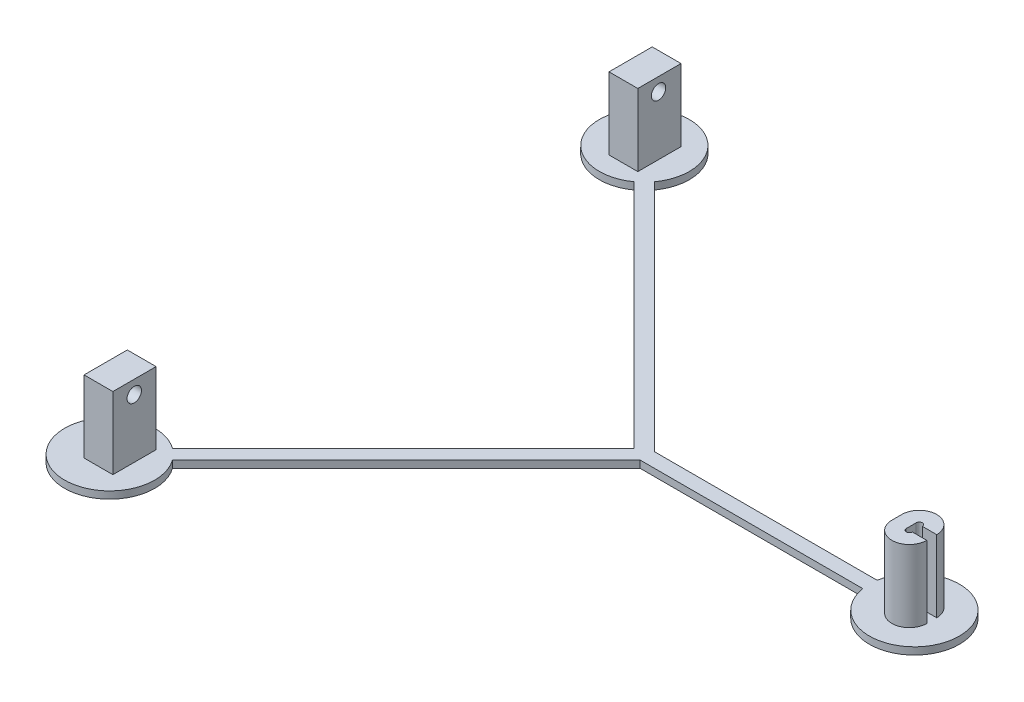
ISO-10303-21;
HEADER;
FILE_DESCRIPTION(('STEP AP214'),'2;1');
FILE_NAME('part.step','',(''),(''),'','','');
FILE_SCHEMA(('AUTOMOTIVE_DESIGN { 1 0 10303 214 1 1 1 1 }'));
ENDSEC;
DATA;
#1=APPLICATION_CONTEXT('core data for automotive mechanical design processes');
#2=APPLICATION_PROTOCOL_DEFINITION('international standard','automotive_design',2000,#1);
#3=PRODUCT_CONTEXT('',#1,'mechanical');
#4=PRODUCT('Part','Part','',(#3));
#5=PRODUCT_RELATED_PRODUCT_CATEGORY('part','',(#4));
#6=PRODUCT_DEFINITION_FORMATION('','',#4);
#7=PRODUCT_DEFINITION_CONTEXT('part definition',#1,'design');
#8=PRODUCT_DEFINITION('design','',#6,#7);
#9=PRODUCT_DEFINITION_SHAPE('','',#8);
#10=(LENGTH_UNIT() NAMED_UNIT(*) SI_UNIT(.MILLI.,.METRE.));
#11=(NAMED_UNIT(*) PLANE_ANGLE_UNIT() SI_UNIT($,.RADIAN.));
#12=(NAMED_UNIT(*) SI_UNIT($,.STERADIAN.) SOLID_ANGLE_UNIT());
#13=UNCERTAINTY_MEASURE_WITH_UNIT(LENGTH_MEASURE(1.E-05),#10,'distance_accuracy_value','');
#14=(GEOMETRIC_REPRESENTATION_CONTEXT(3) GLOBAL_UNCERTAINTY_ASSIGNED_CONTEXT((#13)) GLOBAL_UNIT_ASSIGNED_CONTEXT((#10,
#11,#12)) REPRESENTATION_CONTEXT('',''));
#15=CARTESIAN_POINT('',(0.,0.,0.));
#16=DIRECTION('',(0.,0.,1.));
#17=DIRECTION('',(1.,0.,0.));
#18=AXIS2_PLACEMENT_3D('',#15,#16,#17);
#19=CARTESIAN_POINT('',(0.,2.,-152.499999999999));
#20=DIRECTION('',(0.,-1.,0.));
#21=DIRECTION('',(0.,0.,-1.));
#22=AXIS2_PLACEMENT_3D('',#19,#20,#21);
#23=CYLINDRICAL_SURFACE('',#22,12.5);
#24=CARTESIAN_POINT('',(0.,0.,-152.499999999999));
#25=DIRECTION('',(0.,1.,0.));
#26=DIRECTION('',(0.,0.,1.));
#27=AXIS2_PLACEMENT_3D('',#24,#25,#26);
#28=CIRCLE('',#27,12.5);
#29=CARTESIAN_POINT('',(10.1391777456807,0.,-145.189249379065));
#30=VERTEX_POINT('',#29);
#31=CARTESIAN_POINT('',(7.31075062093449,0.,-142.360822254319));
#32=VERTEX_POINT('',#31);
#33=EDGE_CURVE('E260',#30,#32,#28,.T.);
#34=ORIENTED_EDGE('',*,*,#33,.T.);
#35=DIRECTION('',(0.,-1.,0.));
#36=VECTOR('',#35,1.);
#37=CARTESIAN_POINT('',(7.31075062093449,2.,-142.360822254319));
#38=LINE('',#37,#36);
#39=CARTESIAN_POINT('',(7.31075062093449,2.,-142.360822254319));
#40=VERTEX_POINT('',#39);
#41=EDGE_CURVE('E11',#40,#32,#38,.T.);
#42=ORIENTED_EDGE('',*,*,#41,.F.);
#43=CARTESIAN_POINT('',(0.,2.,-152.499999999999));
#44=DIRECTION('',(0.,1.,0.));
#45=DIRECTION('',(0.,0.,1.));
#46=AXIS2_PLACEMENT_3D('',#43,#44,#45);
#47=CIRCLE('',#46,12.5);
#48=CARTESIAN_POINT('',(10.1391777456807,2.,-145.189249379065));
#49=VERTEX_POINT('',#48);
#50=EDGE_CURVE('E261',#49,#40,#47,.T.);
#51=ORIENTED_EDGE('',*,*,#50,.F.);
#52=DIRECTION('',(0.,-1.,0.));
#53=VECTOR('',#52,1.);
#54=CARTESIAN_POINT('',(10.1391777456807,2.,-145.189249379065));
#55=LINE('',#54,#53);
#56=EDGE_CURVE('E281',#49,#30,#55,.T.);
#57=ORIENTED_EDGE('',*,*,#56,.T.);
#58=EDGE_LOOP('',(#34,#42,#51,#57));
#59=FACE_BOUND('',#58,.T.);
#60=ADVANCED_FACE('F33',(#59),#23,.T.);
#61=CARTESIAN_POINT('',(71.4177848998413,2.,-78.2537879754117));
#62=DIRECTION('',(0.707106781186547,0.,-0.707106781186548));
#63=DIRECTION('',(-0.707106781186548,0.,-0.707106781186547));
#64=AXIS2_PLACEMENT_3D('',#61,#62,#63);
#65=PLANE('',#64);
#66=DIRECTION('',(0.707106781186548,0.,0.707106781186547));
#67=VECTOR('',#66,1.);
#68=CARTESIAN_POINT('',(71.4177848998413,0.,-78.2537879754117));
#69=LINE('',#68,#67);
#70=CARTESIAN_POINT('',(71.4177848998413,0.,-78.2537879754117));
#71=VERTEX_POINT('',#70);
#72=EDGE_CURVE('E284',#32,#71,#69,.T.);
#73=ORIENTED_EDGE('',*,*,#72,.T.);
#74=DIRECTION('',(0.,-1.,0.));
#75=VECTOR('',#74,1.);
#76=CARTESIAN_POINT('',(71.4177848998413,2.,-78.2537879754117));
#77=LINE('',#76,#75);
#78=CARTESIAN_POINT('',(71.4177848998413,2.,-78.2537879754117));
#79=VERTEX_POINT('',#78);
#80=EDGE_CURVE('E40',#79,#71,#77,.T.);
#81=ORIENTED_EDGE('',*,*,#80,.F.);
#82=DIRECTION('',(0.707106781186548,0.,0.707106781186547));
#83=VECTOR('',#82,1.);
#84=CARTESIAN_POINT('',(71.4177848998413,2.,-78.2537879754117));
#85=LINE('',#84,#83);
#86=EDGE_CURVE('E264',#40,#79,#85,.T.);
#87=ORIENTED_EDGE('',*,*,#86,.F.);
#88=ORIENTED_EDGE('',*,*,#41,.T.);
#89=EDGE_LOOP('',(#73,#81,#87,#88));
#90=FACE_BOUND('',#89,.T.);
#91=ADVANCED_FACE('F346',(#90),#65,.F.);
#92=CARTESIAN_POINT('',(71.4177848998413,2.,-78.2537879754117));
#93=DIRECTION('',(0.707106781186548,0.,0.707106781186547));
#94=DIRECTION('',(0.707106781186547,0.,-0.707106781186548));
#95=AXIS2_PLACEMENT_3D('',#92,#93,#94);
#96=PLANE('',#95);
#97=DIRECTION('',(-0.707106781186547,0.,0.707106781186548));
#98=VECTOR('',#97,1.);
#99=CARTESIAN_POINT('',(71.4177848998413,0.,-78.2537879754117));
#100=LINE('',#99,#98);
#101=CARTESIAN_POINT('',(7.3107506209346,0.,-14.1467536965049));
#102=VERTEX_POINT('',#101);
#103=EDGE_CURVE('E286',#71,#102,#100,.T.);
#104=ORIENTED_EDGE('',*,*,#103,.T.);
#105=DIRECTION('',(0.,-1.,0.));
#106=VECTOR('',#105,1.);
#107=CARTESIAN_POINT('',(7.3107506209346,2.,-14.1467536965049));
#108=LINE('',#107,#106);
#109=CARTESIAN_POINT('',(7.3107506209346,2.,-14.1467536965049));
#110=VERTEX_POINT('',#109);
#111=EDGE_CURVE('E316',#110,#102,#108,.T.);
#112=ORIENTED_EDGE('',*,*,#111,.F.);
#113=DIRECTION('',(-0.707106781186547,0.,0.707106781186548));
#114=VECTOR('',#113,1.);
#115=CARTESIAN_POINT('',(71.4177848998413,2.,-78.2537879754117));
#116=LINE('',#115,#114);
#117=EDGE_CURVE('E267',#79,#110,#116,.T.);
#118=ORIENTED_EDGE('',*,*,#117,.F.);
#119=ORIENTED_EDGE('',*,*,#80,.T.);
#120=EDGE_LOOP('',(#104,#112,#118,#119));
#121=FACE_BOUND('',#120,.T.);
#122=ADVANCED_FACE('F323',(#121),#96,.F.);
#123=CARTESIAN_POINT('',(1.17961196366422E-13,2.,-4.00757595082419));
#124=DIRECTION('',(0.,-1.,0.));
#125=DIRECTION('',(0.,0.,-1.));
#126=AXIS2_PLACEMENT_3D('',#123,#124,#125);
#127=CYLINDRICAL_SURFACE('',#126,12.5);
#128=CARTESIAN_POINT('',(1.17961196366422E-13,0.,-4.00757595082419));
#129=DIRECTION('',(0.,1.,0.));
#130=DIRECTION('',(0.,0.,1.));
#131=AXIS2_PLACEMENT_3D('',#128,#129,#130);
#132=CIRCLE('',#131,12.5);
#133=CARTESIAN_POINT('',(10.1391777456808,0.,-11.3183265717587));
#134=VERTEX_POINT('',#133);
#135=EDGE_CURVE('E288',#102,#134,#132,.T.);
#136=ORIENTED_EDGE('',*,*,#135,.T.);
#137=DIRECTION('',(0.,-1.,0.));
#138=VECTOR('',#137,1.);
#139=CARTESIAN_POINT('',(10.1391777456808,2.,-11.3183265717587));
#140=LINE('',#139,#138);
#141=CARTESIAN_POINT('',(10.1391777456808,2.,-11.3183265717587));
#142=VERTEX_POINT('',#141);
#143=EDGE_CURVE('E313',#142,#134,#140,.T.);
#144=ORIENTED_EDGE('',*,*,#143,.F.);
#145=CARTESIAN_POINT('',(1.17961196366422E-13,2.,-4.00757595082419));
#146=DIRECTION('',(0.,1.,0.));
#147=DIRECTION('',(0.,0.,1.));
#148=AXIS2_PLACEMENT_3D('',#145,#146,#147);
#149=CIRCLE('',#148,12.5);
#150=EDGE_CURVE('E269',#110,#142,#149,.T.);
#151=ORIENTED_EDGE('',*,*,#150,.F.);
#152=ORIENTED_EDGE('',*,*,#111,.T.);
#153=EDGE_LOOP('',(#136,#144,#151,#152));
#154=FACE_BOUND('',#153,.T.);
#155=ADVANCED_FACE('F334',(#154),#127,.T.);
#156=CARTESIAN_POINT('',(75.0746391493337,2.,-76.2537879754117));
#157=DIRECTION('',(-0.707106781186548,0.,-0.707106781186547));
#158=DIRECTION('',(-0.707106781186547,0.,0.707106781186548));
#159=AXIS2_PLACEMENT_3D('',#156,#157,#158);
#160=PLANE('',#159);
#161=DIRECTION('',(0.707106781186547,0.,-0.707106781186548));
#162=VECTOR('',#161,1.);
#163=CARTESIAN_POINT('',(75.0746391493337,0.,-76.2537879754117));
#164=LINE('',#163,#162);
#165=CARTESIAN_POINT('',(75.0746391493337,0.,-76.2537879754117));
#166=VERTEX_POINT('',#165);
#167=EDGE_CURVE('E290',#134,#166,#164,.T.);
#168=ORIENTED_EDGE('',*,*,#167,.T.);
#169=DIRECTION('',(0.,-1.,0.));
#170=VECTOR('',#169,1.);
#171=CARTESIAN_POINT('',(75.0746391493337,2.,-76.2537879754117));
#172=LINE('',#171,#170);
#173=CARTESIAN_POINT('',(75.0746391493337,2.,-76.2537879754117));
#174=VERTEX_POINT('',#173);
#175=EDGE_CURVE('E310',#174,#166,#172,.T.);
#176=ORIENTED_EDGE('',*,*,#175,.F.);
#177=DIRECTION('',(0.707106781186547,0.,-0.707106781186548));
#178=VECTOR('',#177,1.);
#179=CARTESIAN_POINT('',(75.0746391493337,2.,-76.2537879754117));
#180=LINE('',#179,#178);
#181=EDGE_CURVE('E271',#142,#174,#180,.T.);
#182=ORIENTED_EDGE('',*,*,#181,.F.);
#183=ORIENTED_EDGE('',*,*,#143,.T.);
#184=EDGE_LOOP('',(#168,#176,#182,#183));
#185=FACE_BOUND('',#184,.T.);
#186=ADVANCED_FACE('F338',(#185),#160,.F.);
#187=CARTESIAN_POINT('',(75.0746391493337,2.,-76.2537879754117));
#188=DIRECTION('',(0.,0.,-1.));
#189=DIRECTION('',(-1.,0.,0.));
#190=AXIS2_PLACEMENT_3D('',#187,#188,#189);
#191=PLANE('',#190);
#192=DIRECTION('',(1.,0.,0.));
#193=VECTOR('',#192,1.);
#194=CARTESIAN_POINT('',(75.0746391493337,0.,-76.2537879754117));
#195=LINE('',#194,#193);
#196=CARTESIAN_POINT('',(136.907249345323,0.,-76.2537879754117));
#197=VERTEX_POINT('',#196);
#198=EDGE_CURVE('E292',#166,#197,#195,.T.);
#199=ORIENTED_EDGE('',*,*,#198,.T.);
#200=DIRECTION('',(0.,-1.,0.));
#201=VECTOR('',#200,1.);
#202=CARTESIAN_POINT('',(136.907249345323,2.,-76.2537879754117));
#203=LINE('',#202,#201);
#204=CARTESIAN_POINT('',(136.907249345323,2.,-76.2537879754117));
#205=VERTEX_POINT('',#204);
#206=EDGE_CURVE('E307',#205,#197,#203,.T.);
#207=ORIENTED_EDGE('',*,*,#206,.F.);
#208=DIRECTION('',(1.,0.,0.));
#209=VECTOR('',#208,1.);
#210=CARTESIAN_POINT('',(75.0746391493337,2.,-76.2537879754117));
#211=LINE('',#210,#209);
#212=EDGE_CURVE('E273',#174,#205,#211,.T.);
#213=ORIENTED_EDGE('',*,*,#212,.F.);
#214=ORIENTED_EDGE('',*,*,#175,.T.);
#215=EDGE_LOOP('',(#199,#207,#213,#214));
#216=FACE_BOUND('',#215,.T.);
#217=ADVANCED_FACE('F364',(#216),#191,.F.);
#218=CARTESIAN_POINT('',(149.246212024576,2.,-78.2537879754121));
#219=DIRECTION('',(0.,-1.,0.));
#220=DIRECTION('',(0.,0.,-1.));
#221=AXIS2_PLACEMENT_3D('',#218,#219,#220);
#222=CYLINDRICAL_SURFACE('',#221,12.5);
#223=CARTESIAN_POINT('',(149.246212024576,0.,-78.2537879754121));
#224=DIRECTION('',(0.,1.,0.));
#225=DIRECTION('',(0.,0.,1.));
#226=AXIS2_PLACEMENT_3D('',#223,#224,#225);
#227=CIRCLE('',#226,12.5);
#228=CARTESIAN_POINT('',(136.907249345323,0.,-80.2537879754117));
#229=VERTEX_POINT('',#228);
#230=EDGE_CURVE('E294',#197,#229,#227,.T.);
#231=ORIENTED_EDGE('',*,*,#230,.T.);
#232=DIRECTION('',(0.,-1.,0.));
#233=VECTOR('',#232,1.);
#234=CARTESIAN_POINT('',(136.907249345323,2.,-80.2537879754117));
#235=LINE('',#234,#233);
#236=CARTESIAN_POINT('',(136.907249345323,2.,-80.2537879754117));
#237=VERTEX_POINT('',#236);
#238=EDGE_CURVE('E304',#237,#229,#235,.T.);
#239=ORIENTED_EDGE('',*,*,#238,.F.);
#240=CARTESIAN_POINT('',(149.246212024576,2.,-78.2537879754121));
#241=DIRECTION('',(0.,1.,0.));
#242=DIRECTION('',(0.,0.,1.));
#243=AXIS2_PLACEMENT_3D('',#240,#241,#242);
#244=CIRCLE('',#243,12.5);
#245=EDGE_CURVE('E275',#205,#237,#244,.T.);
#246=ORIENTED_EDGE('',*,*,#245,.F.);
#247=ORIENTED_EDGE('',*,*,#206,.T.);
#248=EDGE_LOOP('',(#231,#239,#246,#247));
#249=FACE_BOUND('',#248,.T.);
#250=ADVANCED_FACE('F362',(#249),#222,.T.);
#251=CARTESIAN_POINT('',(75.0746391493337,2.,-80.2537879754117));
#252=DIRECTION('',(0.,0.,1.));
#253=DIRECTION('',(1.,0.,0.));
#254=AXIS2_PLACEMENT_3D('',#251,#252,#253);
#255=PLANE('',#254);
#256=DIRECTION('',(-1.,0.,0.));
#257=VECTOR('',#256,1.);
#258=CARTESIAN_POINT('',(75.0746391493337,0.,-80.2537879754117));
#259=LINE('',#258,#257);
#260=CARTESIAN_POINT('',(75.0746391493337,0.,-80.2537879754117));
#261=VERTEX_POINT('',#260);
#262=EDGE_CURVE('E296',#229,#261,#259,.T.);
#263=ORIENTED_EDGE('',*,*,#262,.T.);
#264=DIRECTION('',(0.,-1.,0.));
#265=VECTOR('',#264,1.);
#266=CARTESIAN_POINT('',(75.0746391493337,2.,-80.2537879754117));
#267=LINE('',#266,#265);
#268=CARTESIAN_POINT('',(75.0746391493337,2.,-80.2537879754117));
#269=VERTEX_POINT('',#268);
#270=EDGE_CURVE('E301',#269,#261,#267,.T.);
#271=ORIENTED_EDGE('',*,*,#270,.F.);
#272=DIRECTION('',(-1.,0.,0.));
#273=VECTOR('',#272,1.);
#274=CARTESIAN_POINT('',(75.0746391493337,2.,-80.2537879754117));
#275=LINE('',#274,#273);
#276=EDGE_CURVE('E277',#237,#269,#275,.T.);
#277=ORIENTED_EDGE('',*,*,#276,.F.);
#278=ORIENTED_EDGE('',*,*,#238,.T.);
#279=EDGE_LOOP('',(#263,#271,#277,#278));
#280=FACE_BOUND('',#279,.T.);
#281=ADVANCED_FACE('F358',(#280),#255,.F.);
#282=CARTESIAN_POINT('',(75.0746391493337,2.,-80.2537879754117));
#283=DIRECTION('',(-0.707106781186547,0.,0.707106781186548));
#284=DIRECTION('',(0.707106781186548,0.,0.707106781186547));
#285=AXIS2_PLACEMENT_3D('',#282,#283,#284);
#286=PLANE('',#285);
#287=DIRECTION('',(-0.707106781186548,0.,-0.707106781186547));
#288=VECTOR('',#287,1.);
#289=CARTESIAN_POINT('',(75.0746391493337,0.,-80.2537879754117));
#290=LINE('',#289,#288);
#291=EDGE_CURVE('E265',#261,#30,#290,.T.);
#292=ORIENTED_EDGE('',*,*,#291,.T.);
#293=ORIENTED_EDGE('',*,*,#56,.F.);
#294=DIRECTION('',(-0.707106781186548,0.,-0.707106781186547));
#295=VECTOR('',#294,1.);
#296=CARTESIAN_POINT('',(75.0746391493337,2.,-80.2537879754117));
#297=LINE('',#296,#295);
#298=EDGE_CURVE('E279',#269,#49,#297,.T.);
#299=ORIENTED_EDGE('',*,*,#298,.F.);
#300=ORIENTED_EDGE('',*,*,#270,.T.);
#301=EDGE_LOOP('',(#292,#293,#299,#300));
#302=FACE_BOUND('',#301,.T.);
#303=ADVANCED_FACE('F353',(#302),#286,.F.);
#304=CARTESIAN_POINT('',(0.,0.,-152.499999999999));
#305=DIRECTION('',(0.,1.,0.));
#306=DIRECTION('',(0.,0.,1.));
#307=AXIS2_PLACEMENT_3D('',#304,#305,#306);
#308=PLANE('',#307);
#309=ORIENTED_EDGE('',*,*,#33,.F.);
#310=ORIENTED_EDGE('',*,*,#291,.F.);
#311=ORIENTED_EDGE('',*,*,#262,.F.);
#312=ORIENTED_EDGE('',*,*,#230,.F.);
#313=ORIENTED_EDGE('',*,*,#198,.F.);
#314=ORIENTED_EDGE('',*,*,#167,.F.);
#315=ORIENTED_EDGE('',*,*,#135,.F.);
#316=ORIENTED_EDGE('',*,*,#103,.F.);
#317=ORIENTED_EDGE('',*,*,#72,.F.);
#318=EDGE_LOOP('',(#309,#310,#311,#312,#313,#314,#315,#316,#317));
#319=FACE_BOUND('',#318,.T.);
#320=ADVANCED_FACE('F329',(#319),#308,.F.);
#321=CARTESIAN_POINT('',(149.346212024576,22.,-76.7537879754121));
#322=DIRECTION('',(0.,1.,0.));
#323=DIRECTION('',(0.,0.,1.));
#324=AXIS2_PLACEMENT_3D('',#321,#322,#323);
#325=PLANE('',#324);
#326=DIRECTION('',(-1.,0.,0.));
#327=VECTOR('',#326,1.);
#328=CARTESIAN_POINT('',(150.196212024576,22.,-79.5037879754121));
#329=LINE('',#328,#327);
#330=CARTESIAN_POINT('',(154.196212024576,22.,-79.5037879754121));
#331=VERTEX_POINT('',#330);
#332=CARTESIAN_POINT('',(150.196212024576,22.,-79.5037879754121));
#333=VERTEX_POINT('',#332);
#334=EDGE_CURVE('E212',#331,#333,#329,.T.);
#335=ORIENTED_EDGE('',*,*,#334,.F.);
#336=CARTESIAN_POINT('',(149.346212024576,22.,-79.5037879754121));
#337=DIRECTION('',(0.,1.,0.));
#338=DIRECTION('',(0.,0.,1.));
#339=AXIS2_PLACEMENT_3D('',#336,#337,#338);
#340=CIRCLE('',#339,4.84999999999999);
#341=CARTESIAN_POINT('',(144.496212024576,22.,-79.5037879754121));
#342=VERTEX_POINT('',#341);
#343=EDGE_CURVE('E243',#331,#342,#340,.T.);
#344=ORIENTED_EDGE('',*,*,#343,.T.);
#345=DIRECTION('',(0.,0.,1.));
#346=VECTOR('',#345,1.);
#347=CARTESIAN_POINT('',(144.496212024576,22.,-76.7537879754121));
#348=LINE('',#347,#346);
#349=CARTESIAN_POINT('',(144.496212024576,22.,-76.7537879754121));
#350=VERTEX_POINT('',#349);
#351=EDGE_CURVE('E246',#342,#350,#348,.T.);
#352=ORIENTED_EDGE('',*,*,#351,.T.);
#353=CARTESIAN_POINT('',(149.346212024576,22.,-76.7537879754121));
#354=DIRECTION('',(0.,1.,0.));
#355=DIRECTION('',(0.,0.,1.));
#356=AXIS2_PLACEMENT_3D('',#353,#354,#355);
#357=CIRCLE('',#356,4.84999999999999);
#358=CARTESIAN_POINT('',(154.196212024576,22.,-76.7537879754121));
#359=VERTEX_POINT('',#358);
#360=EDGE_CURVE('E240',#350,#359,#357,.T.);
#361=ORIENTED_EDGE('',*,*,#360,.T.);
#362=DIRECTION('',(1.,0.,0.));
#363=VECTOR('',#362,1.);
#364=CARTESIAN_POINT('',(150.196212024576,22.,-76.7537879754121));
#365=LINE('',#364,#363);
#366=CARTESIAN_POINT('',(150.196212024576,22.,-76.7537879754121));
#367=VERTEX_POINT('',#366);
#368=EDGE_CURVE('E657',#367,#359,#365,.T.);
#369=ORIENTED_EDGE('',*,*,#368,.F.);
#370=CARTESIAN_POINT('',(149.346212024576,22.,-76.7537879754121));
#371=DIRECTION('',(0.,1.,0.));
#372=DIRECTION('',(0.,0.,1.));
#373=AXIS2_PLACEMENT_3D('',#370,#371,#372);
#374=CIRCLE('',#373,0.84999999999999);
#375=CARTESIAN_POINT('',(148.496212024576,22.,-76.7537879754121));
#376=VERTEX_POINT('',#375);
#377=EDGE_CURVE('E229',#376,#367,#374,.T.);
#378=ORIENTED_EDGE('',*,*,#377,.F.);
#379=DIRECTION('',(0.,0.,1.));
#380=VECTOR('',#379,1.);
#381=CARTESIAN_POINT('',(148.496212024576,22.,-76.7537879754121));
#382=LINE('',#381,#380);
#383=CARTESIAN_POINT('',(148.496212024576,22.,-79.5037879754121));
#384=VERTEX_POINT('',#383);
#385=EDGE_CURVE('E719',#384,#376,#382,.T.);
#386=ORIENTED_EDGE('',*,*,#385,.F.);
#387=CARTESIAN_POINT('',(149.346212024576,22.,-79.5037879754121));
#388=DIRECTION('',(0.,1.,0.));
#389=DIRECTION('',(0.,0.,1.));
#390=AXIS2_PLACEMENT_3D('',#387,#388,#389);
#391=CIRCLE('',#390,0.850000000000004);
#392=EDGE_CURVE('E716',#333,#384,#391,.T.);
#393=ORIENTED_EDGE('',*,*,#392,.F.);
#394=EDGE_LOOP('',(#335,#344,#352,#361,#369,#378,#386,#393));
#395=FACE_BOUND('',#394,.T.);
#396=ADVANCED_FACE('F427',(#395),#325,.T.);
#397=CARTESIAN_POINT('',(149.346212024576,22.,-76.7537879754121));
#398=DIRECTION('',(0.,-1.,0.));
#399=DIRECTION('',(0.,0.,-1.));
#400=AXIS2_PLACEMENT_3D('',#397,#398,#399);
#401=CYLINDRICAL_SURFACE('',#400,4.84999999999999);
#402=CARTESIAN_POINT('',(149.346212024576,2.,-76.7537879754121));
#403=DIRECTION('',(0.,1.,0.));
#404=DIRECTION('',(0.,0.,1.));
#405=AXIS2_PLACEMENT_3D('',#402,#403,#404);
#406=CIRCLE('',#405,4.84999999999999);
#407=CARTESIAN_POINT('',(144.496212024576,2.,-76.7537879754121));
#408=VERTEX_POINT('',#407);
#409=CARTESIAN_POINT('',(154.196212024576,2.,-76.7537879754121));
#410=VERTEX_POINT('',#409);
#411=EDGE_CURVE('E230',#408,#410,#406,.T.);
#412=ORIENTED_EDGE('',*,*,#411,.T.);
#413=DIRECTION('',(0.,-1.,0.));
#414=VECTOR('',#413,1.);
#415=CARTESIAN_POINT('',(154.196212024576,22.,-76.7537879754121));
#416=LINE('',#415,#414);
#417=EDGE_CURVE('E207',#359,#410,#416,.T.);
#418=ORIENTED_EDGE('',*,*,#417,.F.);
#419=ORIENTED_EDGE('',*,*,#360,.F.);
#420=DIRECTION('',(0.,-1.,0.));
#421=VECTOR('',#420,1.);
#422=CARTESIAN_POINT('',(144.496212024576,22.,-76.7537879754121));
#423=LINE('',#422,#421);
#424=EDGE_CURVE('E247',#350,#408,#423,.T.);
#425=ORIENTED_EDGE('',*,*,#424,.T.);
#426=EDGE_LOOP('',(#412,#418,#419,#425));
#427=FACE_BOUND('',#426,.T.);
#428=ADVANCED_FACE('F538',(#427),#401,.T.);
#429=CARTESIAN_POINT('',(149.346212024576,22.,-79.5037879754121));
#430=DIRECTION('',(0.,-1.,0.));
#431=DIRECTION('',(0.,0.,-1.));
#432=AXIS2_PLACEMENT_3D('',#429,#430,#431);
#433=CYLINDRICAL_SURFACE('',#432,4.84999999999999);
#434=CARTESIAN_POINT('',(149.346212024576,2.,-79.5037879754121));
#435=DIRECTION('',(0.,1.,0.));
#436=DIRECTION('',(0.,0.,1.));
#437=AXIS2_PLACEMENT_3D('',#434,#435,#436);
#438=CIRCLE('',#437,4.84999999999999);
#439=CARTESIAN_POINT('',(154.196212024576,2.,-79.5037879754121));
#440=VERTEX_POINT('',#439);
#441=CARTESIAN_POINT('',(144.496212024576,2.,-79.5037879754121));
#442=VERTEX_POINT('',#441);
#443=EDGE_CURVE('E233',#440,#442,#438,.T.);
#444=ORIENTED_EDGE('',*,*,#443,.T.);
#445=DIRECTION('',(0.,-1.,0.));
#446=VECTOR('',#445,1.);
#447=CARTESIAN_POINT('',(144.496212024576,22.,-79.5037879754121));
#448=LINE('',#447,#446);
#449=EDGE_CURVE('E254',#342,#442,#448,.T.);
#450=ORIENTED_EDGE('',*,*,#449,.F.);
#451=ORIENTED_EDGE('',*,*,#343,.F.);
#452=DIRECTION('',(0.,-1.,0.));
#453=VECTOR('',#452,1.);
#454=CARTESIAN_POINT('',(154.196212024576,22.,-79.5037879754121));
#455=LINE('',#454,#453);
#456=EDGE_CURVE('E256',#331,#440,#455,.T.);
#457=ORIENTED_EDGE('',*,*,#456,.T.);
#458=EDGE_LOOP('',(#444,#450,#451,#457));
#459=FACE_BOUND('',#458,.T.);
#460=ADVANCED_FACE('F439',(#459),#433,.T.);
#461=CARTESIAN_POINT('',(144.496212024576,22.,-76.7537879754121));
#462=DIRECTION('',(1.,0.,0.));
#463=DIRECTION('',(0.,0.,-1.));
#464=AXIS2_PLACEMENT_3D('',#461,#462,#463);
#465=PLANE('',#464);
#466=DIRECTION('',(0.,0.,1.));
#467=VECTOR('',#466,1.);
#468=CARTESIAN_POINT('',(144.496212024576,2.,-76.7537879754121));
#469=LINE('',#468,#467);
#470=EDGE_CURVE('E244',#442,#408,#469,.T.);
#471=ORIENTED_EDGE('',*,*,#470,.T.);
#472=ORIENTED_EDGE('',*,*,#424,.F.);
#473=ORIENTED_EDGE('',*,*,#351,.F.);
#474=ORIENTED_EDGE('',*,*,#449,.T.);
#475=EDGE_LOOP('',(#471,#472,#473,#474));
#476=FACE_BOUND('',#475,.T.);
#477=ADVANCED_FACE('F434',(#476),#465,.F.);
#478=CARTESIAN_POINT('',(149.346212024576,22.,-76.7537879754121));
#479=DIRECTION('',(0.,-1.,0.));
#480=DIRECTION('',(0.,0.,-1.));
#481=AXIS2_PLACEMENT_3D('',#478,#479,#480);
#482=CYLINDRICAL_SURFACE('',#481,0.84999999999999);
#483=CARTESIAN_POINT('',(149.346212024576,2.,-76.7537879754121));
#484=DIRECTION('',(0.,1.,0.));
#485=DIRECTION('',(0.,0.,1.));
#486=AXIS2_PLACEMENT_3D('',#483,#484,#485);
#487=CIRCLE('',#486,0.84999999999999);
#488=CARTESIAN_POINT('',(148.496212024576,2.,-76.7537879754121));
#489=VERTEX_POINT('',#488);
#490=CARTESIAN_POINT('',(150.196212024576,2.,-76.7537879754121));
#491=VERTEX_POINT('',#490);
#492=EDGE_CURVE('E215',#489,#491,#487,.T.);
#493=ORIENTED_EDGE('',*,*,#492,.F.);
#494=DIRECTION('',(0.,-1.,0.));
#495=VECTOR('',#494,1.);
#496=CARTESIAN_POINT('',(148.496212024576,22.,-76.7537879754121));
#497=LINE('',#496,#495);
#498=EDGE_CURVE('E720',#376,#489,#497,.T.);
#499=ORIENTED_EDGE('',*,*,#498,.F.);
#500=ORIENTED_EDGE('',*,*,#377,.T.);
#501=DIRECTION('',(0.,-1.,0.));
#502=VECTOR('',#501,1.);
#503=CARTESIAN_POINT('',(150.196212024576,22.,-76.7537879754121));
#504=LINE('',#503,#502);
#505=EDGE_CURVE('E204',#367,#491,#504,.T.);
#506=ORIENTED_EDGE('',*,*,#505,.T.);
#507=EDGE_LOOP('',(#493,#499,#500,#506));
#508=FACE_BOUND('',#507,.T.);
#509=ADVANCED_FACE('F227',(#508),#482,.F.);
#510=CARTESIAN_POINT('',(149.346212024576,22.,-79.5037879754121));
#511=DIRECTION('',(0.,-1.,0.));
#512=DIRECTION('',(0.,0.,-1.));
#513=AXIS2_PLACEMENT_3D('',#510,#511,#512);
#514=CYLINDRICAL_SURFACE('',#513,0.850000000000004);
#515=CARTESIAN_POINT('',(149.346212024576,2.,-79.5037879754121));
#516=DIRECTION('',(0.,1.,0.));
#517=DIRECTION('',(0.,0.,1.));
#518=AXIS2_PLACEMENT_3D('',#515,#516,#517);
#519=CIRCLE('',#518,0.850000000000004);
#520=CARTESIAN_POINT('',(150.196212024576,2.,-79.5037879754121));
#521=VERTEX_POINT('',#520);
#522=CARTESIAN_POINT('',(148.496212024576,2.,-79.5037879754121));
#523=VERTEX_POINT('',#522);
#524=EDGE_CURVE('E223',#521,#523,#519,.T.);
#525=ORIENTED_EDGE('',*,*,#524,.F.);
#526=DIRECTION('',(0.,-1.,0.));
#527=VECTOR('',#526,1.);
#528=CARTESIAN_POINT('',(150.196212024576,22.,-79.5037879754121));
#529=LINE('',#528,#527);
#530=EDGE_CURVE('E231',#333,#521,#529,.T.);
#531=ORIENTED_EDGE('',*,*,#530,.F.);
#532=ORIENTED_EDGE('',*,*,#392,.T.);
#533=DIRECTION('',(0.,-1.,0.));
#534=VECTOR('',#533,1.);
#535=CARTESIAN_POINT('',(148.496212024576,22.,-79.5037879754121));
#536=LINE('',#535,#534);
#537=EDGE_CURVE('E236',#384,#523,#536,.T.);
#538=ORIENTED_EDGE('',*,*,#537,.T.);
#539=EDGE_LOOP('',(#525,#531,#532,#538));
#540=FACE_BOUND('',#539,.T.);
#541=ADVANCED_FACE('F454',(#540),#514,.F.);
#542=CARTESIAN_POINT('',(148.496212024576,22.,-76.7537879754121));
#543=DIRECTION('',(1.,0.,0.));
#544=DIRECTION('',(0.,0.,-1.));
#545=AXIS2_PLACEMENT_3D('',#542,#543,#544);
#546=PLANE('',#545);
#547=DIRECTION('',(0.,0.,1.));
#548=VECTOR('',#547,1.);
#549=CARTESIAN_POINT('',(148.496212024576,2.,-76.7537879754121));
#550=LINE('',#549,#548);
#551=EDGE_CURVE('E219',#523,#489,#550,.T.);
#552=ORIENTED_EDGE('',*,*,#551,.F.);
#553=ORIENTED_EDGE('',*,*,#537,.F.);
#554=ORIENTED_EDGE('',*,*,#385,.T.);
#555=ORIENTED_EDGE('',*,*,#498,.T.);
#556=EDGE_LOOP('',(#552,#553,#554,#555));
#557=FACE_BOUND('',#556,.T.);
#558=ADVANCED_FACE('F449',(#557),#546,.T.);
#559=CARTESIAN_POINT('',(0.,2.,-152.499999999999));
#560=DIRECTION('',(0.,1.,0.));
#561=DIRECTION('',(0.,0.,1.));
#562=AXIS2_PLACEMENT_3D('',#559,#560,#561);
#563=PLANE('',#562);
#564=ORIENTED_EDGE('',*,*,#492,.T.);
#565=DIRECTION('',(1.,0.,0.));
#566=VECTOR('',#565,1.);
#567=CARTESIAN_POINT('',(150.196212024576,2.,-76.7537879754121));
#568=LINE('',#567,#566);
#569=EDGE_CURVE('E200',#491,#410,#568,.T.);
#570=ORIENTED_EDGE('',*,*,#569,.T.);
#571=ORIENTED_EDGE('',*,*,#411,.F.);
#572=ORIENTED_EDGE('',*,*,#470,.F.);
#573=ORIENTED_EDGE('',*,*,#443,.F.);
#574=DIRECTION('',(-1.,0.,0.));
#575=VECTOR('',#574,1.);
#576=CARTESIAN_POINT('',(150.196212024576,2.,-79.5037879754121));
#577=LINE('',#576,#575);
#578=EDGE_CURVE('E211',#440,#521,#577,.T.);
#579=ORIENTED_EDGE('',*,*,#578,.T.);
#580=ORIENTED_EDGE('',*,*,#524,.T.);
#581=ORIENTED_EDGE('',*,*,#551,.T.);
#582=EDGE_LOOP('',(#564,#570,#571,#572,#573,#579,#580,#581));
#583=FACE_BOUND('',#582,.T.);
#584=DIRECTION('',(-1.,0.,0.));
#585=VECTOR('',#584,1.);
#586=CARTESIAN_POINT('',(5.38146951790775,2.,-11.5218490133926));
#587=LINE('',#586,#585);
#588=CARTESIAN_POINT('',(5.38146951790775,2.,-11.5218490133926));
#589=VERTEX_POINT('',#588);
#590=CARTESIAN_POINT('',(-2.61853048209225,2.,-11.5218490133926));
#591=VERTEX_POINT('',#590);
#592=EDGE_CURVE('E703',#589,#591,#587,.T.);
#593=ORIENTED_EDGE('',*,*,#592,.F.);
#594=DIRECTION('',(0.,0.,-1.));
#595=VECTOR('',#594,1.);
#596=CARTESIAN_POINT('',(5.38146951790775,2.,-11.5218490133926));
#597=LINE('',#596,#595);
#598=CARTESIAN_POINT('',(5.38146951790775,2.,0.478150986607366));
#599=VERTEX_POINT('',#598);
#600=EDGE_CURVE('E689',#599,#589,#597,.T.);
#601=ORIENTED_EDGE('',*,*,#600,.F.);
#602=DIRECTION('',(1.,0.,0.));
#603=VECTOR('',#602,1.);
#604=CARTESIAN_POINT('',(5.38146951790775,2.,0.478150986607366));
#605=LINE('',#604,#603);
#606=CARTESIAN_POINT('',(-2.61853048209225,2.,0.478150986607362));
#607=VERTEX_POINT('',#606);
#608=EDGE_CURVE('E694',#607,#599,#605,.T.);
#609=ORIENTED_EDGE('',*,*,#608,.F.);
#610=DIRECTION('',(0.,0.,1.));
#611=VECTOR('',#610,1.);
#612=CARTESIAN_POINT('',(-2.61853048209225,2.,-11.5218490133926));
#613=LINE('',#612,#611);
#614=EDGE_CURVE('E705',#591,#607,#613,.T.);
#615=ORIENTED_EDGE('',*,*,#614,.F.);
#616=EDGE_LOOP('',(#593,#601,#609,#615));
#617=FACE_BOUND('',#616,.T.);
#618=ORIENTED_EDGE('',*,*,#50,.T.);
#619=ORIENTED_EDGE('',*,*,#86,.T.);
#620=ORIENTED_EDGE('',*,*,#117,.T.);
#621=ORIENTED_EDGE('',*,*,#150,.T.);
#622=ORIENTED_EDGE('',*,*,#181,.T.);
#623=ORIENTED_EDGE('',*,*,#212,.T.);
#624=ORIENTED_EDGE('',*,*,#245,.T.);
#625=ORIENTED_EDGE('',*,*,#276,.T.);
#626=ORIENTED_EDGE('',*,*,#298,.T.);
#627=EDGE_LOOP('',(#618,#619,#620,#621,#622,#623,#624,#625,#626));
#628=FACE_BOUND('',#627,.T.);
#629=DIRECTION('',(-1.,0.,0.));
#630=VECTOR('',#629,1.);
#631=CARTESIAN_POINT('',(5.38146951790775,2.,-157.304233441489));
#632=LINE('',#631,#630);
#633=CARTESIAN_POINT('',(5.38146951790775,2.,-157.304233441489));
#634=VERTEX_POINT('',#633);
#635=CARTESIAN_POINT('',(-2.61853048209225,2.,-157.304233441489));
#636=VERTEX_POINT('',#635);
#637=EDGE_CURVE('E676',#634,#636,#632,.T.);
#638=ORIENTED_EDGE('',*,*,#637,.F.);
#639=DIRECTION('',(0.,0.,-1.));
#640=VECTOR('',#639,1.);
#641=CARTESIAN_POINT('',(5.38146951790775,2.,-157.304233441489));
#642=LINE('',#641,#640);
#643=CARTESIAN_POINT('',(5.38146951790775,2.,-145.304233441489));
#644=VERTEX_POINT('',#643);
#645=EDGE_CURVE('E660',#644,#634,#642,.T.);
#646=ORIENTED_EDGE('',*,*,#645,.F.);
#647=DIRECTION('',(1.,0.,0.));
#648=VECTOR('',#647,1.);
#649=CARTESIAN_POINT('',(5.38146951790775,2.,-145.304233441489));
#650=LINE('',#649,#648);
#651=CARTESIAN_POINT('',(-2.61853048209225,2.,-145.304233441489));
#652=VERTEX_POINT('',#651);
#653=EDGE_CURVE('E667',#652,#644,#650,.T.);
#654=ORIENTED_EDGE('',*,*,#653,.F.);
#655=DIRECTION('',(0.,0.,1.));
#656=VECTOR('',#655,1.);
#657=CARTESIAN_POINT('',(-2.61853048209225,2.,-157.304233441489));
#658=LINE('',#657,#656);
#659=EDGE_CURVE('E678',#636,#652,#658,.T.);
#660=ORIENTED_EDGE('',*,*,#659,.F.);
#661=EDGE_LOOP('',(#638,#646,#654,#660));
#662=FACE_BOUND('',#661,.T.);
#663=ADVANCED_FACE('F216',(#583,#617,#628,#662),#563,.T.);
#664=CARTESIAN_POINT('',(5.38146951790775,22.,-11.5218490133926));
#665=DIRECTION('',(-1.,0.,0.));
#666=DIRECTION('',(0.,0.,1.));
#667=AXIS2_PLACEMENT_3D('',#664,#665,#666);
#668=PLANE('',#667);
#669=CARTESIAN_POINT('',(5.38146951790775,18.2969366006051,-5.45411816938045));
#670=DIRECTION('',(-1.,0.,0.));
#671=DIRECTION('',(0.,0.,1.));
#672=AXIS2_PLACEMENT_3D('',#669,#670,#671);
#673=CIRCLE('',#672,2.);
#674=CARTESIAN_POINT('',(5.38146951790775,18.2969366006051,-3.45411816938045));
#675=VERTEX_POINT('',#674);
#676=EDGE_CURVE('E652',#675,#675,#673,.T.);
#677=ORIENTED_EDGE('',*,*,#676,.T.);
#678=EDGE_LOOP('',(#677));
#679=FACE_BOUND('',#678,.T.);
#680=ORIENTED_EDGE('',*,*,#600,.T.);
#681=DIRECTION('',(0.,-1.,0.));
#682=VECTOR('',#681,1.);
#683=CARTESIAN_POINT('',(5.38146951790775,22.,-11.5218490133926));
#684=LINE('',#683,#682);
#685=CARTESIAN_POINT('',(5.38146951790775,22.,-11.5218490133926));
#686=VERTEX_POINT('',#685);
#687=EDGE_CURVE('E224',#686,#589,#684,.T.);
#688=ORIENTED_EDGE('',*,*,#687,.F.);
#689=DIRECTION('',(0.,0.,-1.));
#690=VECTOR('',#689,1.);
#691=CARTESIAN_POINT('',(5.38146951790775,22.,-11.5218490133926));
#692=LINE('',#691,#690);
#693=CARTESIAN_POINT('',(5.38146951790775,22.,0.478150986607366));
#694=VERTEX_POINT('',#693);
#695=EDGE_CURVE('E690',#694,#686,#692,.T.);
#696=ORIENTED_EDGE('',*,*,#695,.F.);
#697=DIRECTION('',(0.,-1.,0.));
#698=VECTOR('',#697,1.);
#699=CARTESIAN_POINT('',(5.38146951790775,22.,0.478150986607366));
#700=LINE('',#699,#698);
#701=EDGE_CURVE('E700',#694,#599,#700,.T.);
#702=ORIENTED_EDGE('',*,*,#701,.T.);
#703=EDGE_LOOP('',(#680,#688,#696,#702));
#704=FACE_BOUND('',#703,.T.);
#705=ADVANCED_FACE('F470',(#679,#704),#668,.F.);
#706=CARTESIAN_POINT('',(5.38146951790775,22.,-11.5218490133926));
#707=DIRECTION('',(0.,0.,1.));
#708=DIRECTION('',(1.,0.,0.));
#709=AXIS2_PLACEMENT_3D('',#706,#707,#708);
#710=PLANE('',#709);
#711=ORIENTED_EDGE('',*,*,#592,.T.);
#712=DIRECTION('',(0.,-1.,0.));
#713=VECTOR('',#712,1.);
#714=CARTESIAN_POINT('',(-2.61853048209225,22.,-11.5218490133926));
#715=LINE('',#714,#713);
#716=CARTESIAN_POINT('',(-2.61853048209225,22.,-11.5218490133926));
#717=VERTEX_POINT('',#716);
#718=EDGE_CURVE('E711',#717,#591,#715,.T.);
#719=ORIENTED_EDGE('',*,*,#718,.F.);
#720=DIRECTION('',(-1.,0.,0.));
#721=VECTOR('',#720,1.);
#722=CARTESIAN_POINT('',(5.38146951790775,22.,-11.5218490133926));
#723=LINE('',#722,#721);
#724=EDGE_CURVE('E693',#686,#717,#723,.T.);
#725=ORIENTED_EDGE('',*,*,#724,.F.);
#726=ORIENTED_EDGE('',*,*,#687,.T.);
#727=EDGE_LOOP('',(#711,#719,#725,#726));
#728=FACE_BOUND('',#727,.T.);
#729=ADVANCED_FACE('F464',(#728),#710,.F.);
#730=CARTESIAN_POINT('',(-2.61853048209225,22.,-11.5218490133926));
#731=DIRECTION('',(1.,0.,0.));
#732=DIRECTION('',(0.,0.,-1.));
#733=AXIS2_PLACEMENT_3D('',#730,#731,#732);
#734=PLANE('',#733);
#735=CARTESIAN_POINT('',(-2.61853048209225,18.2969366006051,-5.45411816938045));
#736=DIRECTION('',(-1.,0.,0.));
#737=DIRECTION('',(0.,0.,1.));
#738=AXIS2_PLACEMENT_3D('',#735,#736,#737);
#739=CIRCLE('',#738,2.);
#740=CARTESIAN_POINT('',(-2.61853048209225,18.2969366006051,-3.45411816938045));
#741=VERTEX_POINT('',#740);
#742=EDGE_CURVE('E649',#741,#741,#739,.T.);
#743=ORIENTED_EDGE('',*,*,#742,.F.);
#744=EDGE_LOOP('',(#743));
#745=FACE_BOUND('',#744,.T.);
#746=ORIENTED_EDGE('',*,*,#614,.T.);
#747=DIRECTION('',(0.,-1.,0.));
#748=VECTOR('',#747,1.);
#749=CARTESIAN_POINT('',(-2.61853048209225,22.,0.478150986607367));
#750=LINE('',#749,#748);
#751=CARTESIAN_POINT('',(-2.61853048209225,22.,0.478150986607367));
#752=VERTEX_POINT('',#751);
#753=EDGE_CURVE('E55',#752,#607,#750,.T.);
#754=ORIENTED_EDGE('',*,*,#753,.F.);
#755=DIRECTION('',(0.,0.,1.));
#756=VECTOR('',#755,1.);
#757=CARTESIAN_POINT('',(-2.61853048209225,22.,-11.5218490133926));
#758=LINE('',#757,#756);
#759=EDGE_CURVE('E696',#717,#752,#758,.T.);
#760=ORIENTED_EDGE('',*,*,#759,.F.);
#761=ORIENTED_EDGE('',*,*,#718,.T.);
#762=EDGE_LOOP('',(#746,#754,#760,#761));
#763=FACE_BOUND('',#762,.T.);
#764=ADVANCED_FACE('F469',(#745,#763),#734,.F.);
#765=CARTESIAN_POINT('',(5.38146951790775,22.,0.478150986607366));
#766=DIRECTION('',(0.,0.,-1.));
#767=DIRECTION('',(-1.,0.,0.));
#768=AXIS2_PLACEMENT_3D('',#765,#766,#767);
#769=PLANE('',#768);
#770=ORIENTED_EDGE('',*,*,#608,.T.);
#771=ORIENTED_EDGE('',*,*,#701,.F.);
#772=DIRECTION('',(1.,0.,0.));
#773=VECTOR('',#772,1.);
#774=CARTESIAN_POINT('',(5.38146951790775,22.,0.478150986607366));
#775=LINE('',#774,#773);
#776=EDGE_CURVE('E698',#752,#694,#775,.T.);
#777=ORIENTED_EDGE('',*,*,#776,.F.);
#778=ORIENTED_EDGE('',*,*,#753,.T.);
#779=EDGE_LOOP('',(#770,#771,#777,#778));
#780=FACE_BOUND('',#779,.T.);
#781=ADVANCED_FACE('F479',(#780),#769,.F.);
#782=CARTESIAN_POINT('',(0.,22.,0.));
#783=DIRECTION('',(0.,-1.,0.));
#784=DIRECTION('',(0.,0.,-1.));
#785=AXIS2_PLACEMENT_3D('',#782,#783,#784);
#786=PLANE('',#785);
#787=ORIENTED_EDGE('',*,*,#695,.T.);
#788=ORIENTED_EDGE('',*,*,#724,.T.);
#789=ORIENTED_EDGE('',*,*,#759,.T.);
#790=ORIENTED_EDGE('',*,*,#776,.T.);
#791=EDGE_LOOP('',(#787,#788,#789,#790));
#792=FACE_BOUND('',#791,.T.);
#793=ADVANCED_FACE('F484',(#792),#786,.F.);
#794=CARTESIAN_POINT('',(5.38146951790775,22.,-157.304233441489));
#795=DIRECTION('',(-1.,0.,0.));
#796=DIRECTION('',(0.,0.,1.));
#797=AXIS2_PLACEMENT_3D('',#794,#795,#796);
#798=PLANE('',#797);
#799=CARTESIAN_POINT('',(5.38146951790775,18.2969366006051,-151.053457781443));
#800=DIRECTION('',(-1.,0.,0.));
#801=DIRECTION('',(0.,0.,1.));
#802=AXIS2_PLACEMENT_3D('',#799,#800,#801);
#803=CIRCLE('',#802,1.99999999999997);
#804=CARTESIAN_POINT('',(5.38146951790775,18.2969366006051,-149.053457781443));
#805=VERTEX_POINT('',#804);
#806=EDGE_CURVE('E648',#805,#805,#803,.T.);
#807=ORIENTED_EDGE('',*,*,#806,.T.);
#808=EDGE_LOOP('',(#807));
#809=FACE_BOUND('',#808,.T.);
#810=ORIENTED_EDGE('',*,*,#645,.T.);
#811=DIRECTION('',(0.,-1.,0.));
#812=VECTOR('',#811,1.);
#813=CARTESIAN_POINT('',(5.38146951790775,22.,-157.304233441489));
#814=LINE('',#813,#812);
#815=CARTESIAN_POINT('',(5.38146951790775,22.,-157.304233441489));
#816=VERTEX_POINT('',#815);
#817=EDGE_CURVE('E687',#816,#634,#814,.T.);
#818=ORIENTED_EDGE('',*,*,#817,.F.);
#819=DIRECTION('',(0.,0.,-1.));
#820=VECTOR('',#819,1.);
#821=CARTESIAN_POINT('',(5.38146951790775,22.,-157.304233441489));
#822=LINE('',#821,#820);
#823=CARTESIAN_POINT('',(5.38146951790775,22.,-145.304233441489));
#824=VERTEX_POINT('',#823);
#825=EDGE_CURVE('E663',#824,#816,#822,.T.);
#826=ORIENTED_EDGE('',*,*,#825,.F.);
#827=DIRECTION('',(0.,-1.,0.));
#828=VECTOR('',#827,1.);
#829=CARTESIAN_POINT('',(5.38146951790775,22.,-145.304233441489));
#830=LINE('',#829,#828);
#831=EDGE_CURVE('E673',#824,#644,#830,.T.);
#832=ORIENTED_EDGE('',*,*,#831,.T.);
#833=EDGE_LOOP('',(#810,#818,#826,#832));
#834=FACE_BOUND('',#833,.T.);
#835=ADVANCED_FACE('F493',(#809,#834),#798,.F.);
#836=CARTESIAN_POINT('',(5.38146951790775,22.,-157.304233441489));
#837=DIRECTION('',(0.,0.,1.));
#838=DIRECTION('',(1.,0.,0.));
#839=AXIS2_PLACEMENT_3D('',#836,#837,#838);
#840=PLANE('',#839);
#841=ORIENTED_EDGE('',*,*,#637,.T.);
#842=DIRECTION('',(0.,-1.,0.));
#843=VECTOR('',#842,1.);
#844=CARTESIAN_POINT('',(-2.61853048209225,22.,-157.304233441489));
#845=LINE('',#844,#843);
#846=CARTESIAN_POINT('',(-2.61853048209225,22.,-157.304233441489));
#847=VERTEX_POINT('',#846);
#848=EDGE_CURVE('E684',#847,#636,#845,.T.);
#849=ORIENTED_EDGE('',*,*,#848,.F.);
#850=DIRECTION('',(-1.,0.,0.));
#851=VECTOR('',#850,1.);
#852=CARTESIAN_POINT('',(5.38146951790775,22.,-157.304233441489));
#853=LINE('',#852,#851);
#854=EDGE_CURVE('E666',#816,#847,#853,.T.);
#855=ORIENTED_EDGE('',*,*,#854,.F.);
#856=ORIENTED_EDGE('',*,*,#817,.T.);
#857=EDGE_LOOP('',(#841,#849,#855,#856));
#858=FACE_BOUND('',#857,.T.);
#859=ADVANCED_FACE('F501',(#858),#840,.F.);
#860=CARTESIAN_POINT('',(-2.61853048209225,22.,-157.304233441489));
#861=DIRECTION('',(1.,0.,0.));
#862=DIRECTION('',(0.,0.,-1.));
#863=AXIS2_PLACEMENT_3D('',#860,#861,#862);
#864=PLANE('',#863);
#865=CARTESIAN_POINT('',(-2.61853048209227,18.2969366006051,-151.053457781443));
#866=DIRECTION('',(-1.,0.,0.));
#867=DIRECTION('',(0.,0.,-1.));
#868=AXIS2_PLACEMENT_3D('',#865,#866,#867);
#869=CIRCLE('',#868,1.99999999999997);
#870=CARTESIAN_POINT('',(-2.61853048209227,18.2969366006051,-153.053457781443));
#871=VERTEX_POINT('',#870);
#872=EDGE_CURVE('E645',#871,#871,#869,.T.);
#873=ORIENTED_EDGE('',*,*,#872,.F.);
#874=EDGE_LOOP('',(#873));
#875=FACE_BOUND('',#874,.T.);
#876=ORIENTED_EDGE('',*,*,#659,.T.);
#877=DIRECTION('',(0.,-1.,0.));
#878=VECTOR('',#877,1.);
#879=CARTESIAN_POINT('',(-2.61853048209225,22.,-145.304233441489));
#880=LINE('',#879,#878);
#881=CARTESIAN_POINT('',(-2.61853048209225,22.,-145.304233441489));
#882=VERTEX_POINT('',#881);
#883=EDGE_CURVE('E47',#882,#652,#880,.T.);
#884=ORIENTED_EDGE('',*,*,#883,.F.);
#885=DIRECTION('',(0.,0.,1.));
#886=VECTOR('',#885,1.);
#887=CARTESIAN_POINT('',(-2.61853048209225,22.,-157.304233441489));
#888=LINE('',#887,#886);
#889=EDGE_CURVE('E669',#847,#882,#888,.T.);
#890=ORIENTED_EDGE('',*,*,#889,.F.);
#891=ORIENTED_EDGE('',*,*,#848,.T.);
#892=EDGE_LOOP('',(#876,#884,#890,#891));
#893=FACE_BOUND('',#892,.T.);
#894=ADVANCED_FACE('F506',(#875,#893),#864,.F.);
#895=CARTESIAN_POINT('',(5.38146951790775,22.,-145.304233441489));
#896=DIRECTION('',(0.,0.,-1.));
#897=DIRECTION('',(-1.,0.,0.));
#898=AXIS2_PLACEMENT_3D('',#895,#896,#897);
#899=PLANE('',#898);
#900=ORIENTED_EDGE('',*,*,#653,.T.);
#901=ORIENTED_EDGE('',*,*,#831,.F.);
#902=DIRECTION('',(1.,0.,0.));
#903=VECTOR('',#902,1.);
#904=CARTESIAN_POINT('',(5.38146951790775,22.,-145.304233441489));
#905=LINE('',#904,#903);
#906=EDGE_CURVE('E671',#882,#824,#905,.T.);
#907=ORIENTED_EDGE('',*,*,#906,.F.);
#908=ORIENTED_EDGE('',*,*,#883,.T.);
#909=EDGE_LOOP('',(#900,#901,#907,#908));
#910=FACE_BOUND('',#909,.T.);
#911=ADVANCED_FACE('F514',(#910),#899,.F.);
#912=CARTESIAN_POINT('',(0.,22.,0.));
#913=DIRECTION('',(0.,-1.,0.));
#914=DIRECTION('',(0.,0.,-1.));
#915=AXIS2_PLACEMENT_3D('',#912,#913,#914);
#916=PLANE('',#915);
#917=ORIENTED_EDGE('',*,*,#825,.T.);
#918=ORIENTED_EDGE('',*,*,#854,.T.);
#919=ORIENTED_EDGE('',*,*,#889,.T.);
#920=ORIENTED_EDGE('',*,*,#906,.T.);
#921=EDGE_LOOP('',(#917,#918,#919,#920));
#922=FACE_BOUND('',#921,.T.);
#923=ADVANCED_FACE('F519',(#922),#916,.F.);
#924=CARTESIAN_POINT('',(150.196212024576,2.,-79.5037879754121));
#925=DIRECTION('',(0.,0.,-1.));
#926=DIRECTION('',(-1.,0.,0.));
#927=AXIS2_PLACEMENT_3D('',#924,#925,#926);
#928=PLANE('',#927);
#929=ORIENTED_EDGE('',*,*,#334,.T.);
#930=ORIENTED_EDGE('',*,*,#530,.T.);
#931=ORIENTED_EDGE('',*,*,#578,.F.);
#932=ORIENTED_EDGE('',*,*,#456,.F.);
#933=EDGE_LOOP('',(#929,#930,#931,#932));
#934=FACE_BOUND('',#933,.T.);
#935=ADVANCED_FACE('F528',(#934),#928,.F.);
#936=CARTESIAN_POINT('',(150.196212024576,2.,-76.7537879754121));
#937=DIRECTION('',(0.,0.,1.));
#938=DIRECTION('',(1.,0.,0.));
#939=AXIS2_PLACEMENT_3D('',#936,#937,#938);
#940=PLANE('',#939);
#941=ORIENTED_EDGE('',*,*,#368,.T.);
#942=ORIENTED_EDGE('',*,*,#417,.T.);
#943=ORIENTED_EDGE('',*,*,#569,.F.);
#944=ORIENTED_EDGE('',*,*,#505,.F.);
#945=EDGE_LOOP('',(#941,#942,#943,#944));
#946=FACE_BOUND('',#945,.T.);
#947=ADVANCED_FACE('F202',(#946),#940,.F.);
#948=CARTESIAN_POINT('',(7.38146951790775,18.2969366006051,-5.45411816938045));
#949=DIRECTION('',(-1.,0.,0.));
#950=DIRECTION('',(0.,0.,1.));
#951=AXIS2_PLACEMENT_3D('',#948,#949,#950);
#952=CYLINDRICAL_SURFACE('',#951,2.);
#953=ORIENTED_EDGE('',*,*,#742,.T.);
#954=EDGE_LOOP('',(#953));
#955=FACE_BOUND('',#954,.T.);
#956=ORIENTED_EDGE('',*,*,#676,.F.);
#957=EDGE_LOOP('',(#956));
#958=FACE_BOUND('',#957,.T.);
#959=ADVANCED_FACE('F591',(#955,#958),#952,.F.);
#960=CARTESIAN_POINT('',(7.38146951790773,18.2969366006051,-151.053457781443));
#961=DIRECTION('',(-1.,0.,0.));
#962=DIRECTION('',(0.,0.,1.));
#963=AXIS2_PLACEMENT_3D('',#960,#961,#962);
#964=CYLINDRICAL_SURFACE('',#963,1.99999999999997);
#965=ORIENTED_EDGE('',*,*,#872,.T.);
#966=EDGE_LOOP('',(#965));
#967=FACE_BOUND('',#966,.T.);
#968=ORIENTED_EDGE('',*,*,#806,.F.);
#969=EDGE_LOOP('',(#968));
#970=FACE_BOUND('',#969,.T.);
#971=ADVANCED_FACE('F628',(#967,#970),#964,.F.);
#972=CLOSED_SHELL('',(#60,#91,#122,#155,#186,#217,#250,#281,#303,#320,#396,#428,#460,#477,#509,
#541,#558,#663,#705,#729,#764,#781,#793,#835,#859,#894,#911,#923,#935,#947,#959,#971));
#973=MANIFOLD_SOLID_BREP('B2',#972);
#974=ADVANCED_BREP_SHAPE_REPRESENTATION('',(#18,#973),#14);
#975=SHAPE_DEFINITION_REPRESENTATION(#9,#974);
ENDSEC;
END-ISO-10303-21;
